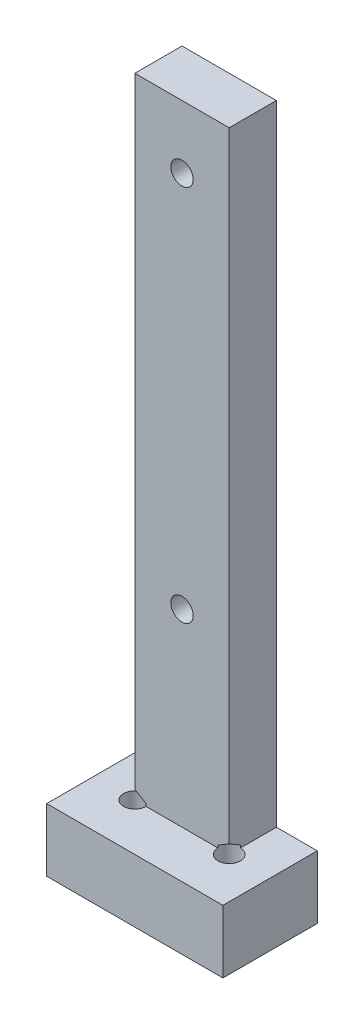
ISO-10303-21;
HEADER;
FILE_DESCRIPTION(('STEP AP214'),'2;1');
FILE_NAME('part.step','',(''),(''),'','','');
FILE_SCHEMA(('AUTOMOTIVE_DESIGN { 1 0 10303 214 1 1 1 1 }'));
ENDSEC;
DATA;
#1=APPLICATION_CONTEXT('core data for automotive mechanical design processes');
#2=APPLICATION_PROTOCOL_DEFINITION('international standard','automotive_design',2000,#1);
#3=PRODUCT_CONTEXT('',#1,'mechanical');
#4=PRODUCT('Part','Part','',(#3));
#5=PRODUCT_RELATED_PRODUCT_CATEGORY('part','',(#4));
#6=PRODUCT_DEFINITION_FORMATION('','',#4);
#7=PRODUCT_DEFINITION_CONTEXT('part definition',#1,'design');
#8=PRODUCT_DEFINITION('design','',#6,#7);
#9=PRODUCT_DEFINITION_SHAPE('','',#8);
#10=(LENGTH_UNIT() NAMED_UNIT(*) SI_UNIT(.MILLI.,.METRE.));
#11=(NAMED_UNIT(*) PLANE_ANGLE_UNIT() SI_UNIT($,.RADIAN.));
#12=(NAMED_UNIT(*) SI_UNIT($,.STERADIAN.) SOLID_ANGLE_UNIT());
#13=UNCERTAINTY_MEASURE_WITH_UNIT(LENGTH_MEASURE(1.E-05),#10,'distance_accuracy_value','');
#14=(GEOMETRIC_REPRESENTATION_CONTEXT(3) GLOBAL_UNCERTAINTY_ASSIGNED_CONTEXT((#13)) GLOBAL_UNIT_ASSIGNED_CONTEXT((#10,
#11,#12)) REPRESENTATION_CONTEXT('',''));
#15=CARTESIAN_POINT('',(0.,0.,0.));
#16=DIRECTION('',(0.,0.,1.));
#17=DIRECTION('',(1.,0.,0.));
#18=AXIS2_PLACEMENT_3D('',#15,#16,#17);
#19=CARTESIAN_POINT('',(8.89000000000001,69.85,4.7625));
#20=DIRECTION('',(-1.,0.,0.));
#21=DIRECTION('',(0.,0.,1.));
#22=AXIS2_PLACEMENT_3D('',#19,#20,#21);
#23=PLANE('',#22);
#24=DIRECTION('',(0.,-1.,0.));
#25=VECTOR('',#24,1.);
#26=CARTESIAN_POINT('',(8.89000000000001,69.85,-4.7625));
#27=LINE('',#26,#25);
#28=CARTESIAN_POINT('',(8.89000000000001,6.35,-4.7625));
#29=VERTEX_POINT('',#28);
#30=CARTESIAN_POINT('',(8.89000000000001,0.,-4.7625));
#31=VERTEX_POINT('',#30);
#32=EDGE_CURVE('E168',#29,#31,#27,.T.);
#33=ORIENTED_EDGE('',*,*,#32,.F.);
#34=DIRECTION('',(0.,0.,-1.));
#35=VECTOR('',#34,1.);
#36=CARTESIAN_POINT('',(8.89000000000001,6.35,4.7625));
#37=LINE('',#36,#35);
#38=CARTESIAN_POINT('',(8.89000000000001,6.35,4.7625));
#39=VERTEX_POINT('',#38);
#40=EDGE_CURVE('E235',#39,#29,#37,.T.);
#41=ORIENTED_EDGE('',*,*,#40,.F.);
#42=DIRECTION('',(0.,-1.,0.));
#43=VECTOR('',#42,1.);
#44=CARTESIAN_POINT('',(8.89000000000001,69.85,4.7625));
#45=LINE('',#44,#43);
#46=CARTESIAN_POINT('',(8.89000000000001,0.,4.7625));
#47=VERTEX_POINT('',#46);
#48=EDGE_CURVE('E174',#39,#47,#45,.T.);
#49=ORIENTED_EDGE('',*,*,#48,.T.);
#50=DIRECTION('',(0.,0.,-1.));
#51=VECTOR('',#50,1.);
#52=CARTESIAN_POINT('',(8.89000000000001,0.,4.7625));
#53=LINE('',#52,#51);
#54=EDGE_CURVE('E149',#47,#31,#53,.T.);
#55=ORIENTED_EDGE('',*,*,#54,.T.);
#56=EDGE_LOOP('',(#33,#41,#49,#55));
#57=FACE_BOUND('',#56,.T.);
#58=ADVANCED_FACE('F50',(#57),#23,.F.);
#59=CARTESIAN_POINT('',(-8.88999999999999,69.85,-4.7625));
#60=DIRECTION('',(0.,0.,1.));
#61=DIRECTION('',(1.,0.,0.));
#62=AXIS2_PLACEMENT_3D('',#59,#60,#61);
#63=PLANE('',#62);
#64=CARTESIAN_POINT('',(0.,25.4,-4.7625));
#65=DIRECTION('',(0.,0.,1.));
#66=DIRECTION('',(1.,0.,0.));
#67=AXIS2_PLACEMENT_3D('',#64,#65,#66);
#68=CIRCLE('',#67,1.13029999999999);
#69=CARTESIAN_POINT('',(1.13029999999999,25.4,-4.7625));
#70=VERTEX_POINT('',#69);
#71=EDGE_CURVE('E505',#70,#70,#68,.T.);
#72=ORIENTED_EDGE('',*,*,#71,.T.);
#73=EDGE_LOOP('',(#72));
#74=FACE_BOUND('',#73,.T.);
#75=CARTESIAN_POINT('',(0.,63.5,-4.7625));
#76=DIRECTION('',(0.,0.,1.));
#77=DIRECTION('',(1.,0.,0.));
#78=AXIS2_PLACEMENT_3D('',#75,#76,#77);
#79=CIRCLE('',#78,1.13029999999999);
#80=CARTESIAN_POINT('',(1.13029999999999,63.5,-4.7625));
#81=VERTEX_POINT('',#80);
#82=EDGE_CURVE('E499',#81,#81,#79,.T.);
#83=ORIENTED_EDGE('',*,*,#82,.T.);
#84=EDGE_LOOP('',(#83));
#85=FACE_BOUND('',#84,.T.);
#86=DIRECTION('',(1.,0.,0.));
#87=VECTOR('',#86,1.);
#88=CARTESIAN_POINT('',(-8.88999999999999,6.35,-4.7625));
#89=LINE('',#88,#87);
#90=CARTESIAN_POINT('',(-8.88999999999999,6.35,-4.7625));
#91=VERTEX_POINT('',#90);
#92=CARTESIAN_POINT('',(-4.76249999999999,6.35,-4.7625));
#93=VERTEX_POINT('',#92);
#94=EDGE_CURVE('E153',#91,#93,#89,.T.);
#95=ORIENTED_EDGE('',*,*,#94,.T.);
#96=DIRECTION('',(0.,1.,0.));
#97=VECTOR('',#96,1.);
#98=CARTESIAN_POINT('',(-4.76249999999999,69.85,-4.7625));
#99=LINE('',#98,#97);
#100=CARTESIAN_POINT('',(-4.76249999999999,69.85,-4.7625));
#101=VERTEX_POINT('',#100);
#102=EDGE_CURVE('E160',#93,#101,#99,.T.);
#103=ORIENTED_EDGE('',*,*,#102,.T.);
#104=DIRECTION('',(-1.,0.,0.));
#105=VECTOR('',#104,1.);
#106=CARTESIAN_POINT('',(-8.88999999999999,69.85,-4.7625));
#107=LINE('',#106,#105);
#108=CARTESIAN_POINT('',(4.76250000000001,69.85,-4.7625));
#109=VERTEX_POINT('',#108);
#110=EDGE_CURVE('E241',#109,#101,#107,.T.);
#111=ORIENTED_EDGE('',*,*,#110,.F.);
#112=DIRECTION('',(0.,-1.,0.));
#113=VECTOR('',#112,1.);
#114=CARTESIAN_POINT('',(4.76250000000001,69.85,-4.7625));
#115=LINE('',#114,#113);
#116=CARTESIAN_POINT('',(4.76250000000001,6.35,-4.7625));
#117=VERTEX_POINT('',#116);
#118=EDGE_CURVE('E520',#109,#117,#115,.T.);
#119=ORIENTED_EDGE('',*,*,#118,.T.);
#120=DIRECTION('',(1.,0.,0.));
#121=VECTOR('',#120,1.);
#122=CARTESIAN_POINT('',(8.89000000000001,6.35,-4.7625));
#123=LINE('',#122,#121);
#124=EDGE_CURVE('E524',#117,#29,#123,.T.);
#125=ORIENTED_EDGE('',*,*,#124,.T.);
#126=ORIENTED_EDGE('',*,*,#32,.T.);
#127=DIRECTION('',(-1.,0.,0.));
#128=VECTOR('',#127,1.);
#129=CARTESIAN_POINT('',(-8.88999999999999,0.,-4.7625));
#130=LINE('',#129,#128);
#131=CARTESIAN_POINT('',(-8.88999999999999,0.,-4.7625));
#132=VERTEX_POINT('',#131);
#133=EDGE_CURVE('E165',#31,#132,#130,.T.);
#134=ORIENTED_EDGE('',*,*,#133,.T.);
#135=DIRECTION('',(0.,-1.,0.));
#136=VECTOR('',#135,1.);
#137=CARTESIAN_POINT('',(-8.88999999999999,69.85,-4.7625));
#138=LINE('',#137,#136);
#139=EDGE_CURVE('E143',#91,#132,#138,.T.);
#140=ORIENTED_EDGE('',*,*,#139,.F.);
#141=EDGE_LOOP('',(#95,#103,#111,#119,#125,#126,#134,#140));
#142=FACE_BOUND('',#141,.T.);
#143=ADVANCED_FACE('F163',(#74,#85,#142),#63,.F.);
#144=CARTESIAN_POINT('',(-8.88999999999999,69.85,4.7625));
#145=DIRECTION('',(1.,0.,0.));
#146=DIRECTION('',(0.,0.,-1.));
#147=AXIS2_PLACEMENT_3D('',#144,#145,#146);
#148=PLANE('',#147);
#149=DIRECTION('',(0.,0.,1.));
#150=VECTOR('',#149,1.);
#151=CARTESIAN_POINT('',(-8.88999999999999,6.35,4.7625));
#152=LINE('',#151,#150);
#153=CARTESIAN_POINT('',(-8.88999999999999,6.35,4.7625));
#154=VERTEX_POINT('',#153);
#155=EDGE_CURVE('E138',#91,#154,#152,.T.);
#156=ORIENTED_EDGE('',*,*,#155,.F.);
#157=ORIENTED_EDGE('',*,*,#139,.T.);
#158=DIRECTION('',(0.,0.,1.));
#159=VECTOR('',#158,1.);
#160=CARTESIAN_POINT('',(-8.88999999999999,0.,4.7625));
#161=LINE('',#160,#159);
#162=CARTESIAN_POINT('',(-8.88999999999999,0.,4.7625));
#163=VERTEX_POINT('',#162);
#164=EDGE_CURVE('E251',#132,#163,#161,.T.);
#165=ORIENTED_EDGE('',*,*,#164,.T.);
#166=DIRECTION('',(0.,-1.,0.));
#167=VECTOR('',#166,1.);
#168=CARTESIAN_POINT('',(-8.88999999999999,69.85,4.7625));
#169=LINE('',#168,#167);
#170=EDGE_CURVE('E145',#154,#163,#169,.T.);
#171=ORIENTED_EDGE('',*,*,#170,.F.);
#172=EDGE_LOOP('',(#156,#157,#165,#171));
#173=FACE_BOUND('',#172,.T.);
#174=ADVANCED_FACE('F140',(#173),#148,.F.);
#175=CARTESIAN_POINT('',(-8.88999999999999,69.85,4.7625));
#176=DIRECTION('',(0.,0.,-1.));
#177=DIRECTION('',(-1.,0.,0.));
#178=AXIS2_PLACEMENT_3D('',#175,#176,#177);
#179=PLANE('',#178);
#180=ORIENTED_EDGE('',*,*,#48,.F.);
#181=DIRECTION('',(1.,0.,0.));
#182=VECTOR('',#181,1.);
#183=CARTESIAN_POINT('',(-8.88999999999999,6.35,4.7625));
#184=LINE('',#183,#182);
#185=EDGE_CURVE('E233',#154,#39,#184,.T.);
#186=ORIENTED_EDGE('',*,*,#185,.F.);
#187=ORIENTED_EDGE('',*,*,#170,.T.);
#188=DIRECTION('',(1.,0.,0.));
#189=VECTOR('',#188,1.);
#190=CARTESIAN_POINT('',(-8.88999999999999,0.,4.7625));
#191=LINE('',#190,#189);
#192=EDGE_CURVE('E245',#163,#47,#191,.T.);
#193=ORIENTED_EDGE('',*,*,#192,.T.);
#194=EDGE_LOOP('',(#180,#186,#187,#193));
#195=FACE_BOUND('',#194,.T.);
#196=ADVANCED_FACE('F264',(#195),#179,.F.);
#197=CARTESIAN_POINT('',(0.,69.85,0.));
#198=DIRECTION('',(0.,-1.,0.));
#199=DIRECTION('',(0.,0.,-1.));
#200=AXIS2_PLACEMENT_3D('',#197,#198,#199);
#201=PLANE('',#200);
#202=ORIENTED_EDGE('',*,*,#110,.T.);
#203=DIRECTION('',(0.,0.,1.));
#204=VECTOR('',#203,1.);
#205=CARTESIAN_POINT('',(-4.76249999999999,69.85,-4.7625));
#206=LINE('',#205,#204);
#207=CARTESIAN_POINT('',(-4.76249999999999,69.85,0.));
#208=VERTEX_POINT('',#207);
#209=EDGE_CURVE('E519',#101,#208,#206,.T.);
#210=ORIENTED_EDGE('',*,*,#209,.T.);
#211=DIRECTION('',(-1.,0.,0.));
#212=VECTOR('',#211,1.);
#213=CARTESIAN_POINT('',(-8.88999999999999,69.85,0.));
#214=LINE('',#213,#212);
#215=CARTESIAN_POINT('',(4.76250000000001,69.85,0.));
#216=VERTEX_POINT('',#215);
#217=EDGE_CURVE('E230',#216,#208,#214,.T.);
#218=ORIENTED_EDGE('',*,*,#217,.F.);
#219=DIRECTION('',(0.,0.,1.));
#220=VECTOR('',#219,1.);
#221=CARTESIAN_POINT('',(4.76250000000001,69.85,-4.7625));
#222=LINE('',#221,#220);
#223=EDGE_CURVE('E528',#109,#216,#222,.T.);
#224=ORIENTED_EDGE('',*,*,#223,.F.);
#225=EDGE_LOOP('',(#202,#210,#218,#224));
#226=FACE_BOUND('',#225,.T.);
#227=ADVANCED_FACE('F268',(#226),#201,.F.);
#228=CARTESIAN_POINT('',(0.,0.,0.));
#229=DIRECTION('',(0.,-1.,0.));
#230=DIRECTION('',(0.,0.,-1.));
#231=AXIS2_PLACEMENT_3D('',#228,#229,#230);
#232=PLANE('',#231);
#233=CARTESIAN_POINT('',(4.7625,0.,0.));
#234=DIRECTION('',(0.,-1.,0.));
#235=DIRECTION('',(0.,0.,-1.));
#236=AXIS2_PLACEMENT_3D('',#233,#234,#235);
#237=CIRCLE('',#236,1.13029999999999);
#238=CARTESIAN_POINT('',(4.7625,0.,-1.13029999999999));
#239=VERTEX_POINT('',#238);
#240=EDGE_CURVE('E221',#239,#239,#237,.T.);
#241=ORIENTED_EDGE('',*,*,#240,.F.);
#242=EDGE_LOOP('',(#241));
#243=FACE_BOUND('',#242,.T.);
#244=CARTESIAN_POINT('',(-4.7625,0.,0.));
#245=DIRECTION('',(0.,-1.,0.));
#246=DIRECTION('',(0.,0.,-1.));
#247=AXIS2_PLACEMENT_3D('',#244,#245,#246);
#248=CIRCLE('',#247,1.13029999999999);
#249=CARTESIAN_POINT('',(-4.7625,0.,-1.13029999999999));
#250=VERTEX_POINT('',#249);
#251=EDGE_CURVE('E214',#250,#250,#248,.T.);
#252=ORIENTED_EDGE('',*,*,#251,.F.);
#253=EDGE_LOOP('',(#252));
#254=FACE_BOUND('',#253,.T.);
#255=ORIENTED_EDGE('',*,*,#54,.F.);
#256=ORIENTED_EDGE('',*,*,#192,.F.);
#257=ORIENTED_EDGE('',*,*,#164,.F.);
#258=ORIENTED_EDGE('',*,*,#133,.F.);
#259=EDGE_LOOP('',(#255,#256,#257,#258));
#260=FACE_BOUND('',#259,.T.);
#261=ADVANCED_FACE('F266',(#243,#254,#260),#232,.T.);
#262=CARTESIAN_POINT('',(0.,6.35,0.));
#263=DIRECTION('',(0.,-1.,0.));
#264=DIRECTION('',(0.,0.,-1.));
#265=AXIS2_PLACEMENT_3D('',#262,#263,#264);
#266=PLANE('',#265);
#267=ORIENTED_EDGE('',*,*,#40,.T.);
#268=ORIENTED_EDGE('',*,*,#124,.F.);
#269=DIRECTION('',(0.,0.,1.));
#270=VECTOR('',#269,1.);
#271=CARTESIAN_POINT('',(4.76250000000001,6.35,-4.7625));
#272=LINE('',#271,#270);
#273=CARTESIAN_POINT('',(4.76250000000001,6.35,-1.13029999999999));
#274=VERTEX_POINT('',#273);
#275=EDGE_CURVE('E212',#117,#274,#272,.T.);
#276=ORIENTED_EDGE('',*,*,#275,.T.);
#277=CARTESIAN_POINT('',(4.7625,6.35,0.));
#278=DIRECTION('',(0.,-1.,0.));
#279=DIRECTION('',(0.,0.,-1.));
#280=AXIS2_PLACEMENT_3D('',#277,#278,#279);
#281=CIRCLE('',#280,1.13029999999999);
#282=CARTESIAN_POINT('',(3.63220000000001,6.35,0.));
#283=VERTEX_POINT('',#282);
#284=EDGE_CURVE('E208',#274,#283,#281,.T.);
#285=ORIENTED_EDGE('',*,*,#284,.T.);
#286=DIRECTION('',(-1.,0.,0.));
#287=VECTOR('',#286,1.);
#288=CARTESIAN_POINT('',(-8.88999999999999,6.35,0.));
#289=LINE('',#288,#287);
#290=CARTESIAN_POINT('',(-3.63220000000001,6.35,0.));
#291=VERTEX_POINT('',#290);
#292=EDGE_CURVE('E150',#283,#291,#289,.T.);
#293=ORIENTED_EDGE('',*,*,#292,.T.);
#294=CARTESIAN_POINT('',(-4.7625,6.35,0.));
#295=DIRECTION('',(0.,-1.,0.));
#296=DIRECTION('',(0.,0.,-1.));
#297=AXIS2_PLACEMENT_3D('',#294,#295,#296);
#298=CIRCLE('',#297,1.13029999999999);
#299=CARTESIAN_POINT('',(-4.76249999999999,6.35,-1.13029999999999));
#300=VERTEX_POINT('',#299);
#301=EDGE_CURVE('E227',#291,#300,#298,.T.);
#302=ORIENTED_EDGE('',*,*,#301,.T.);
#303=DIRECTION('',(0.,0.,1.));
#304=VECTOR('',#303,1.);
#305=CARTESIAN_POINT('',(-4.76249999999999,6.35,-4.7625));
#306=LINE('',#305,#304);
#307=EDGE_CURVE('E155',#93,#300,#306,.T.);
#308=ORIENTED_EDGE('',*,*,#307,.F.);
#309=ORIENTED_EDGE('',*,*,#94,.F.);
#310=ORIENTED_EDGE('',*,*,#155,.T.);
#311=ORIENTED_EDGE('',*,*,#185,.T.);
#312=EDGE_LOOP('',(#267,#268,#276,#285,#293,#302,#308,#309,#310,#311));
#313=FACE_BOUND('',#312,.T.);
#314=ADVANCED_FACE('F154',(#313),#266,.F.);
#315=CARTESIAN_POINT('',(-8.88999999999999,-18.4067869616074,0.));
#316=DIRECTION('',(0.,0.,-1.));
#317=DIRECTION('',(-1.,0.,0.));
#318=AXIS2_PLACEMENT_3D('',#315,#316,#317);
#319=PLANE('',#318);
#320=CARTESIAN_POINT('',(0.,25.4,0.));
#321=DIRECTION('',(0.,0.,1.));
#322=DIRECTION('',(1.,0.,0.));
#323=AXIS2_PLACEMENT_3D('',#320,#321,#322);
#324=CIRCLE('',#323,1.13029999999999);
#325=CARTESIAN_POINT('',(1.13029999999999,25.4,0.));
#326=VERTEX_POINT('',#325);
#327=EDGE_CURVE('E510',#326,#326,#324,.T.);
#328=ORIENTED_EDGE('',*,*,#327,.F.);
#329=EDGE_LOOP('',(#328));
#330=FACE_BOUND('',#329,.T.);
#331=CARTESIAN_POINT('',(0.,63.5,0.));
#332=DIRECTION('',(0.,0.,1.));
#333=DIRECTION('',(1.,0.,0.));
#334=AXIS2_PLACEMENT_3D('',#331,#332,#333);
#335=CIRCLE('',#334,1.13029999999999);
#336=CARTESIAN_POINT('',(1.13029999999999,63.5,0.));
#337=VERTEX_POINT('',#336);
#338=EDGE_CURVE('E496',#337,#337,#335,.T.);
#339=ORIENTED_EDGE('',*,*,#338,.F.);
#340=EDGE_LOOP('',(#339));
#341=FACE_BOUND('',#340,.T.);
#342=ORIENTED_EDGE('',*,*,#217,.T.);
#343=DIRECTION('',(0.,1.,0.));
#344=VECTOR('',#343,1.);
#345=CARTESIAN_POINT('',(-4.76249999999999,69.85,0.));
#346=LINE('',#345,#344);
#347=CARTESIAN_POINT('',(-4.76249999999999,7.28315275768686,0.));
#348=VERTEX_POINT('',#347);
#349=EDGE_CURVE('E161',#348,#208,#346,.T.);
#350=ORIENTED_EDGE('',*,*,#349,.F.);
#351=DIRECTION('',(0.857167300702111,-0.515038074910056,0.));
#352=VECTOR('',#351,1.);
#353=CARTESIAN_POINT('',(-4.7625,7.28315275768685,0.));
#354=LINE('',#353,#352);
#355=CARTESIAN_POINT('',(-3.6322,6.604,0.));
#356=VERTEX_POINT('',#355);
#357=EDGE_CURVE('E172',#348,#356,#354,.T.);
#358=ORIENTED_EDGE('',*,*,#357,.T.);
#359=DIRECTION('',(0.,-1.,0.));
#360=VECTOR('',#359,1.);
#361=CARTESIAN_POINT('',(-3.63220000000001,0.,0.));
#362=LINE('',#361,#360);
#363=EDGE_CURVE('E181',#356,#291,#362,.T.);
#364=ORIENTED_EDGE('',*,*,#363,.T.);
#365=ORIENTED_EDGE('',*,*,#292,.F.);
#366=DIRECTION('',(0.,-1.,0.));
#367=VECTOR('',#366,1.);
#368=CARTESIAN_POINT('',(3.63220000000001,0.,0.));
#369=LINE('',#368,#367);
#370=CARTESIAN_POINT('',(3.6322,6.604,0.));
#371=VERTEX_POINT('',#370);
#372=EDGE_CURVE('E189',#283,#371,#369,.F.);
#373=ORIENTED_EDGE('',*,*,#372,.T.);
#374=DIRECTION('',(0.857167300702111,0.515038074910056,0.));
#375=VECTOR('',#374,1.);
#376=CARTESIAN_POINT('',(4.7625,7.28315275768685,0.));
#377=LINE('',#376,#375);
#378=CARTESIAN_POINT('',(4.7625,7.28315275768685,0.));
#379=VERTEX_POINT('',#378);
#380=EDGE_CURVE('E185',#371,#379,#377,.T.);
#381=ORIENTED_EDGE('',*,*,#380,.T.);
#382=DIRECTION('',(0.,-1.,0.));
#383=VECTOR('',#382,1.);
#384=CARTESIAN_POINT('',(4.76250000000001,69.85,0.));
#385=LINE('',#384,#383);
#386=EDGE_CURVE('E72',#216,#379,#385,.T.);
#387=ORIENTED_EDGE('',*,*,#386,.F.);
#388=EDGE_LOOP('',(#342,#350,#358,#364,#365,#373,#381,#387));
#389=FACE_BOUND('',#388,.T.);
#390=ADVANCED_FACE('F202',(#330,#341,#389),#319,.F.);
#391=CARTESIAN_POINT('',(-4.7625,0.,0.));
#392=DIRECTION('',(0.,-1.,0.));
#393=DIRECTION('',(0.,0.,-1.));
#394=AXIS2_PLACEMENT_3D('',#391,#392,#393);
#395=CYLINDRICAL_SURFACE('',#394,1.13029999999999);
#396=ORIENTED_EDGE('',*,*,#251,.T.);
#397=EDGE_LOOP('',(#396));
#398=FACE_BOUND('',#397,.T.);
#399=CARTESIAN_POINT('',(-4.7625,6.604,0.));
#400=DIRECTION('',(0.,-1.,0.));
#401=DIRECTION('',(0.,0.,-1.));
#402=AXIS2_PLACEMENT_3D('',#399,#400,#401);
#403=CIRCLE('',#402,1.1303);
#404=CARTESIAN_POINT('',(-4.76249999999999,6.604,-1.1303));
#405=VERTEX_POINT('',#404);
#406=EDGE_CURVE('E219',#405,#356,#403,.T.);
#407=ORIENTED_EDGE('',*,*,#406,.F.);
#408=DIRECTION('',(0.,-1.,0.));
#409=VECTOR('',#408,1.);
#410=CARTESIAN_POINT('',(-4.76249999999999,0.,-1.13029999999999));
#411=LINE('',#410,#409);
#412=EDGE_CURVE('E65',#405,#300,#411,.T.);
#413=ORIENTED_EDGE('',*,*,#412,.T.);
#414=ORIENTED_EDGE('',*,*,#301,.F.);
#415=ORIENTED_EDGE('',*,*,#363,.F.);
#416=EDGE_LOOP('',(#407,#413,#414,#415));
#417=FACE_BOUND('',#416,.T.);
#418=ADVANCED_FACE('F323',(#398,#417),#395,.F.);
#419=CARTESIAN_POINT('',(-4.7625,6.604,0.));
#420=DIRECTION('',(0.,-1.,0.));
#421=DIRECTION('',(0.,0.,-1.));
#422=AXIS2_PLACEMENT_3D('',#419,#420,#421);
#423=CONICAL_SURFACE('',#422,1.1303,1.02974425867665);
#424=ORIENTED_EDGE('',*,*,#357,.F.);
#425=DIRECTION('',(0.,0.515038074910056,0.857167300702111));
#426=VECTOR('',#425,1.);
#427=CARTESIAN_POINT('',(-4.76249999999999,7.28315275768685,0.));
#428=LINE('',#427,#426);
#429=EDGE_CURVE('E12',#348,#405,#428,.F.);
#430=ORIENTED_EDGE('',*,*,#429,.T.);
#431=ORIENTED_EDGE('',*,*,#406,.T.);
#432=EDGE_LOOP('',(#424,#430,#431));
#433=FACE_BOUND('',#432,.T.);
#434=ADVANCED_FACE('F335',(#433),#423,.F.);
#435=CARTESIAN_POINT('',(4.7625,0.,0.));
#436=DIRECTION('',(0.,-1.,0.));
#437=DIRECTION('',(0.,0.,-1.));
#438=AXIS2_PLACEMENT_3D('',#435,#436,#437);
#439=CYLINDRICAL_SURFACE('',#438,1.13029999999999);
#440=ORIENTED_EDGE('',*,*,#240,.T.);
#441=EDGE_LOOP('',(#440));
#442=FACE_BOUND('',#441,.T.);
#443=ORIENTED_EDGE('',*,*,#284,.F.);
#444=DIRECTION('',(0.,-1.,0.));
#445=VECTOR('',#444,1.);
#446=CARTESIAN_POINT('',(4.76250000000001,0.,-1.13029999999999));
#447=LINE('',#446,#445);
#448=CARTESIAN_POINT('',(4.76250000000001,6.604,-1.1303));
#449=VERTEX_POINT('',#448);
#450=EDGE_CURVE('E516',#274,#449,#447,.F.);
#451=ORIENTED_EDGE('',*,*,#450,.T.);
#452=CARTESIAN_POINT('',(4.7625,6.604,0.));
#453=DIRECTION('',(0.,-1.,0.));
#454=DIRECTION('',(0.,0.,-1.));
#455=AXIS2_PLACEMENT_3D('',#452,#453,#454);
#456=CIRCLE('',#455,1.1303);
#457=EDGE_CURVE('E197',#371,#449,#456,.T.);
#458=ORIENTED_EDGE('',*,*,#457,.F.);
#459=ORIENTED_EDGE('',*,*,#372,.F.);
#460=EDGE_LOOP('',(#443,#451,#458,#459));
#461=FACE_BOUND('',#460,.T.);
#462=ADVANCED_FACE('F207',(#442,#461),#439,.F.);
#463=CARTESIAN_POINT('',(4.7625,6.604,0.));
#464=DIRECTION('',(0.,-1.,0.));
#465=DIRECTION('',(0.,0.,-1.));
#466=AXIS2_PLACEMENT_3D('',#463,#464,#465);
#467=CONICAL_SURFACE('',#466,1.1303,1.02974425867665);
#468=ORIENTED_EDGE('',*,*,#457,.T.);
#469=DIRECTION('',(0.,-0.515038074910056,-0.857167300702111));
#470=VECTOR('',#469,1.);
#471=CARTESIAN_POINT('',(4.76250000000001,7.28315275768685,0.));
#472=LINE('',#471,#470);
#473=EDGE_CURVE('E58',#449,#379,#472,.F.);
#474=ORIENTED_EDGE('',*,*,#473,.T.);
#475=ORIENTED_EDGE('',*,*,#380,.F.);
#476=EDGE_LOOP('',(#468,#474,#475));
#477=FACE_BOUND('',#476,.T.);
#478=ADVANCED_FACE('F195',(#477),#467,.F.);
#479=CARTESIAN_POINT('',(0.,63.5,0.));
#480=DIRECTION('',(0.,0.,1.));
#481=DIRECTION('',(1.,0.,0.));
#482=AXIS2_PLACEMENT_3D('',#479,#480,#481);
#483=CYLINDRICAL_SURFACE('',#482,1.13029999999999);
#484=ORIENTED_EDGE('',*,*,#338,.T.);
#485=EDGE_LOOP('',(#484));
#486=FACE_BOUND('',#485,.T.);
#487=ORIENTED_EDGE('',*,*,#82,.F.);
#488=EDGE_LOOP('',(#487));
#489=FACE_BOUND('',#488,.T.);
#490=ADVANCED_FACE('F369',(#486,#489),#483,.F.);
#491=CARTESIAN_POINT('',(0.,25.4,0.));
#492=DIRECTION('',(0.,0.,1.));
#493=DIRECTION('',(1.,0.,0.));
#494=AXIS2_PLACEMENT_3D('',#491,#492,#493);
#495=CYLINDRICAL_SURFACE('',#494,1.13029999999999);
#496=ORIENTED_EDGE('',*,*,#327,.T.);
#497=EDGE_LOOP('',(#496));
#498=FACE_BOUND('',#497,.T.);
#499=ORIENTED_EDGE('',*,*,#71,.F.);
#500=EDGE_LOOP('',(#499));
#501=FACE_BOUND('',#500,.T.);
#502=ADVANCED_FACE('F382',(#498,#501),#495,.F.);
#503=CARTESIAN_POINT('',(4.76250000000001,69.85,-4.7625));
#504=DIRECTION('',(-1.,0.,0.));
#505=DIRECTION('',(0.,0.,1.));
#506=AXIS2_PLACEMENT_3D('',#503,#504,#505);
#507=PLANE('',#506);
#508=ORIENTED_EDGE('',*,*,#275,.F.);
#509=ORIENTED_EDGE('',*,*,#118,.F.);
#510=ORIENTED_EDGE('',*,*,#223,.T.);
#511=ORIENTED_EDGE('',*,*,#386,.T.);
#512=ORIENTED_EDGE('',*,*,#473,.F.);
#513=ORIENTED_EDGE('',*,*,#450,.F.);
#514=EDGE_LOOP('',(#508,#509,#510,#511,#512,#513));
#515=FACE_BOUND('',#514,.T.);
#516=ADVANCED_FACE('F377',(#515),#507,.F.);
#517=CARTESIAN_POINT('',(-4.76249999999999,69.85,-4.7625));
#518=DIRECTION('',(1.,0.,0.));
#519=DIRECTION('',(0.,0.,-1.));
#520=AXIS2_PLACEMENT_3D('',#517,#518,#519);
#521=PLANE('',#520);
#522=ORIENTED_EDGE('',*,*,#429,.F.);
#523=ORIENTED_EDGE('',*,*,#349,.T.);
#524=ORIENTED_EDGE('',*,*,#209,.F.);
#525=ORIENTED_EDGE('',*,*,#102,.F.);
#526=ORIENTED_EDGE('',*,*,#307,.T.);
#527=ORIENTED_EDGE('',*,*,#412,.F.);
#528=EDGE_LOOP('',(#522,#523,#524,#525,#526,#527));
#529=FACE_BOUND('',#528,.T.);
#530=ADVANCED_FACE('F381',(#529),#521,.F.);
#531=CLOSED_SHELL('',(#58,#143,#174,#196,#227,#261,#314,#390,#418,#434,#462,#478,#490,#502,#516,#530));
#532=MANIFOLD_SOLID_BREP('B2',#531);
#533=ADVANCED_BREP_SHAPE_REPRESENTATION('',(#18,#532),#14);
#534=SHAPE_DEFINITION_REPRESENTATION(#9,#533);
ENDSEC;
END-ISO-10303-21;
